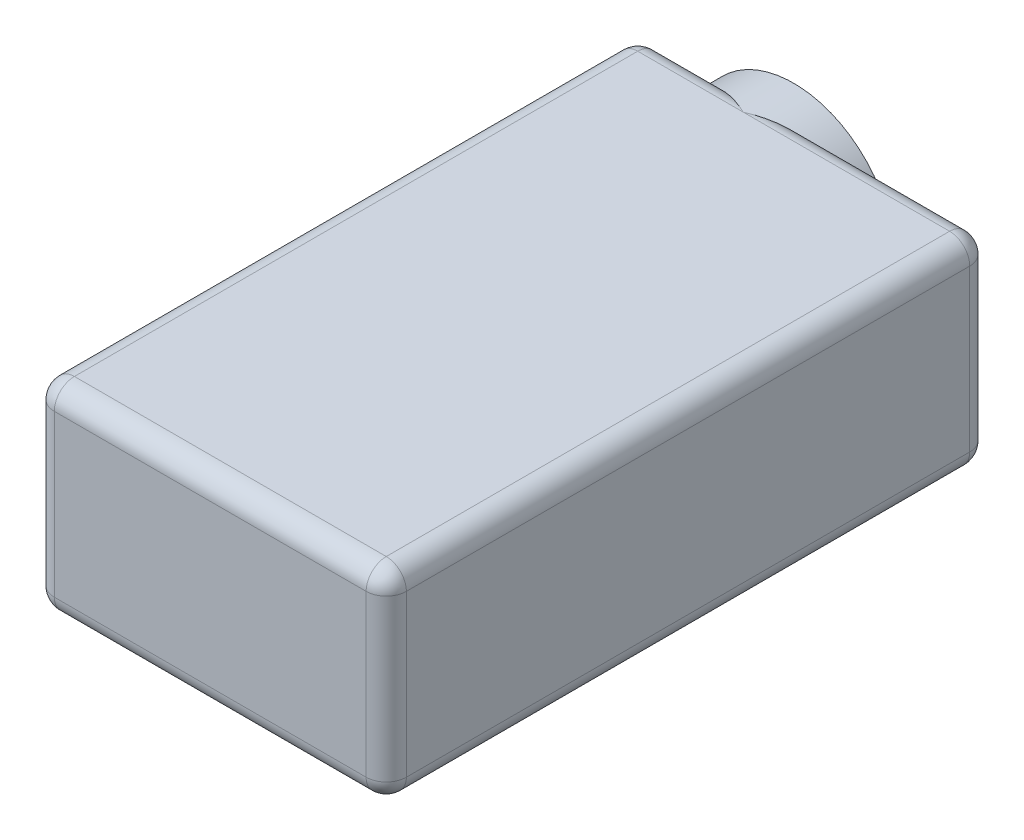
ISO-10303-21;
HEADER;
FILE_DESCRIPTION(('STEP AP214'),'2;1');
FILE_NAME('part.step','',(''),(''),'','','');
FILE_SCHEMA(('AUTOMOTIVE_DESIGN { 1 0 10303 214 1 1 1 1 }'));
ENDSEC;
DATA;
#1=APPLICATION_CONTEXT('core data for automotive mechanical design processes');
#2=APPLICATION_PROTOCOL_DEFINITION('international standard','automotive_design',2000,#1);
#3=PRODUCT_CONTEXT('',#1,'mechanical');
#4=PRODUCT('Part','Part','',(#3));
#5=PRODUCT_RELATED_PRODUCT_CATEGORY('part','',(#4));
#6=PRODUCT_DEFINITION_FORMATION('','',#4);
#7=PRODUCT_DEFINITION_CONTEXT('part definition',#1,'design');
#8=PRODUCT_DEFINITION('design','',#6,#7);
#9=PRODUCT_DEFINITION_SHAPE('','',#8);
#10=(LENGTH_UNIT() NAMED_UNIT(*) SI_UNIT(.MILLI.,.METRE.));
#11=(NAMED_UNIT(*) PLANE_ANGLE_UNIT() SI_UNIT($,.RADIAN.));
#12=(NAMED_UNIT(*) SI_UNIT($,.STERADIAN.) SOLID_ANGLE_UNIT());
#13=UNCERTAINTY_MEASURE_WITH_UNIT(LENGTH_MEASURE(1.E-05),#10,'distance_accuracy_value','');
#14=(GEOMETRIC_REPRESENTATION_CONTEXT(3) GLOBAL_UNCERTAINTY_ASSIGNED_CONTEXT((#13)) GLOBAL_UNIT_ASSIGNED_CONTEXT((#10,
#11,#12)) REPRESENTATION_CONTEXT('',''));
#15=CARTESIAN_POINT('',(0.,0.,0.));
#16=DIRECTION('',(0.,0.,1.));
#17=DIRECTION('',(1.,0.,0.));
#18=AXIS2_PLACEMENT_3D('',#15,#16,#17);
#19=CARTESIAN_POINT('',(-17.5,20.,-30.));
#20=DIRECTION('',(0.,0.,1.));
#21=DIRECTION('',(1.,0.,0.));
#22=AXIS2_PLACEMENT_3D('',#19,#20,#21);
#23=PLANE('',#22);
#24=DIRECTION('',(-1.,0.,0.));
#25=VECTOR('',#24,1.);
#26=CARTESIAN_POINT('',(-17.5,18.,-30.));
#27=LINE('',#26,#25);
#28=CARTESIAN_POINT('',(-15.5,18.,-30.));
#29=VERTEX_POINT('',#28);
#30=CARTESIAN_POINT('',(-11.,18.,-30.));
#31=VERTEX_POINT('',#30);
#32=EDGE_CURVE('E162',#29,#31,#27,.F.);
#33=ORIENTED_EDGE('',*,*,#32,.T.);
#34=CARTESIAN_POINT('',(-5.,10.,-30.));
#35=DIRECTION('',(0.,0.,1.));
#36=DIRECTION('',(1.,0.,0.));
#37=AXIS2_PLACEMENT_3D('',#34,#35,#36);
#38=CIRCLE('',#37,10.);
#39=CARTESIAN_POINT('',(-11.,2.,-30.));
#40=VERTEX_POINT('',#39);
#41=EDGE_CURVE('E161',#31,#40,#38,.T.);
#42=ORIENTED_EDGE('',*,*,#41,.T.);
#43=DIRECTION('',(-1.,0.,0.));
#44=VECTOR('',#43,1.);
#45=CARTESIAN_POINT('',(-17.5,2.,-30.));
#46=LINE('',#45,#44);
#47=CARTESIAN_POINT('',(-15.5,2.,-30.));
#48=VERTEX_POINT('',#47);
#49=EDGE_CURVE('E147',#40,#48,#46,.T.);
#50=ORIENTED_EDGE('',*,*,#49,.T.);
#51=DIRECTION('',(0.,-1.,0.));
#52=VECTOR('',#51,1.);
#53=CARTESIAN_POINT('',(-15.5,20.,-30.));
#54=LINE('',#53,#52);
#55=EDGE_CURVE('E158',#48,#29,#54,.F.);
#56=ORIENTED_EDGE('',*,*,#55,.T.);
#57=EDGE_LOOP('',(#33,#42,#50,#56));
#58=FACE_BOUND('',#57,.T.);
#59=ADVANCED_FACE('F33',(#58),#23,.F.);
#60=CARTESIAN_POINT('',(0.,18.,-28.));
#61=DIRECTION('',(-1.,0.,0.));
#62=DIRECTION('',(0.,0.,1.));
#63=AXIS2_PLACEMENT_3D('',#60,#61,#62);
#64=CYLINDRICAL_SURFACE('',#63,2.);
#65=CARTESIAN_POINT('',(-11.,18.,-30.));
#66=CARTESIAN_POINT('',(-10.9369536224631,18.0472862882957,-29.9999954704325));
#67=CARTESIAN_POINT('',(-10.8733624225271,18.0938134787529,-29.9983236145491));
#68=CARTESIAN_POINT('',(-10.7452199474967,18.1852695333375,-29.9919285918336));
#69=CARTESIAN_POINT('',(-10.6806689822841,18.2301988981222,-29.9872063898342));
#70=CARTESIAN_POINT('',(-10.4859703158345,18.3623378279778,-29.9689117195481));
#71=CARTESIAN_POINT('',(-10.3545238112513,18.4470878572111,-29.9512088855844));
#72=CARTESIAN_POINT('',(-10.0898913085944,18.6091190391924,-29.9068252398303));
#73=CARTESIAN_POINT('',(-9.9567231295198,18.6864469043144,-29.8802060675995));
#74=CARTESIAN_POINT('',(-9.68822829248466,18.8342526275324,-29.8194524225561));
#75=CARTESIAN_POINT('',(-9.55290027046692,18.904725939813,-29.7853130107879));
#76=CARTESIAN_POINT('',(-9.19386066920139,19.081477109722,-29.6870630509099));
#77=CARTESIAN_POINT('',(-8.96872744405728,19.1819879312217,-29.6177082570013));
#78=CARTESIAN_POINT('',(-8.51531575035662,19.3649551460672,-29.466620027569));
#79=CARTESIAN_POINT('',(-8.28703598898859,19.4474038680968,-29.3848813572129));
#80=CARTESIAN_POINT('',(-7.82739571511391,19.5950152471495,-29.2119794583593));
#81=CARTESIAN_POINT('',(-7.59602666438796,19.6601092975224,-29.1207807482314));
#82=CARTESIAN_POINT('',(-7.13185849777535,19.7730351186086,-28.9319051562162));
#83=CARTESIAN_POINT('',(-6.8990598651593,19.8208724279425,-28.8342303647894));
#84=CARTESIAN_POINT('',(-6.39179187240824,19.9065704488633,-28.6171555408011));
#85=CARTESIAN_POINT('',(-6.11713414409591,19.9412373642432,-28.4969369257089));
#86=CARTESIAN_POINT('',(-5.56770287236358,19.9876693958688,-28.2538571616655));
#87=CARTESIAN_POINT('',(-5.29293075740746,19.9994819850186,-28.1310020275233));
#88=CARTESIAN_POINT('',(-5.01217156566726,19.99999444154,-28.0054432888421));
#89=CARTESIAN_POINT('',(-5.00608575618738,19.9999999968566,-28.0027216320485));
#90=CARTESIAN_POINT('',(-5.,20.,-28.));
#91=B_SPLINE_CURVE_WITH_KNOTS('',3,(#65,#66,#67,#68,#69,#70,#71,#72,#73,#74,#75,#76,#77,#78,#79,
#80,#81,#82,#83,#84,#85,#86,#87,#88,#89,#90),.UNSPECIFIED.,.F.,.F.,(4,2,2,2,2,2,2,2,2,2,2,2,4),
(0.,0.236371159892259,0.472667591526935,0.944315101860225,1.41276713949742,1.88152775757088,
2.64870335126686,3.41620414998971,4.18669550285127,4.9569393429184,5.86148159841712,
6.76414291697836,6.78414292392342),.UNSPECIFIED.);
#92=CARTESIAN_POINT('',(-5.,20.,-28.));
#93=VERTEX_POINT('',#92);
#94=EDGE_CURVE('E61',#31,#93,#91,.T.);
#95=ORIENTED_EDGE('',*,*,#94,.F.);
#96=ORIENTED_EDGE('',*,*,#32,.F.);
#97=CARTESIAN_POINT('',(-15.5,18.,-28.));
#98=DIRECTION('',(-1.,0.,0.));
#99=DIRECTION('',(0.,0.,1.));
#100=AXIS2_PLACEMENT_3D('',#97,#98,#99);
#101=CIRCLE('',#100,2.);
#102=CARTESIAN_POINT('',(-15.5,20.,-28.));
#103=VERTEX_POINT('',#102);
#104=EDGE_CURVE('E342',#103,#29,#101,.T.);
#105=ORIENTED_EDGE('',*,*,#104,.F.);
#106=DIRECTION('',(-1.,0.,0.));
#107=VECTOR('',#106,1.);
#108=CARTESIAN_POINT('',(0.,20.,-28.));
#109=LINE('',#108,#107);
#110=EDGE_CURVE('E303',#93,#103,#109,.T.);
#111=ORIENTED_EDGE('',*,*,#110,.F.);
#112=EDGE_LOOP('',(#95,#96,#105,#111));
#113=FACE_BOUND('',#112,.T.);
#114=ADVANCED_FACE('F247',(#113),#64,.T.);
#115=CARTESIAN_POINT('',(-17.5,2.,-28.));
#116=DIRECTION('',(1.,0.,0.));
#117=DIRECTION('',(0.,0.,-1.));
#118=AXIS2_PLACEMENT_3D('',#115,#116,#117);
#119=CYLINDRICAL_SURFACE('',#118,2.);
#120=CARTESIAN_POINT('',(1.00000000000001,2.,-30.));
#121=CARTESIAN_POINT('',(0.936953622463164,1.95271371170432,-29.9999954704325));
#122=CARTESIAN_POINT('',(0.873362422527192,1.90618652124718,-29.9983236145491));
#123=CARTESIAN_POINT('',(0.745219947496929,1.8147304666626,-29.9919285918336));
#124=CARTESIAN_POINT('',(0.680668982284341,1.76980110187795,-29.9872063898342));
#125=CARTESIAN_POINT('',(0.485970315834909,1.63766217202242,-29.9689117195482));
#126=CARTESIAN_POINT('',(0.354523811251751,1.55291214278924,-29.9512088855845));
#127=CARTESIAN_POINT('',(0.0898913085948727,1.39088096080787,-29.9068252398304));
#128=CARTESIAN_POINT('',(-0.0432768704797975,1.31355309568585,-29.8802060675996));
#129=CARTESIAN_POINT('',(-0.311771707515132,1.16574737246771,-29.8194524225562));
#130=CARTESIAN_POINT('',(-0.44709972953297,1.09527406018707,-29.7853130107879));
#131=CARTESIAN_POINT('',(-0.806139330798666,0.91852289027801,-29.6870630509099));
#132=CARTESIAN_POINT('',(-1.03127255594286,0.818012068778287,-29.6177082570013));
#133=CARTESIAN_POINT('',(-1.48468424964363,0.635044853932708,-29.4666200275689));
#134=CARTESIAN_POINT('',(-1.7129640110117,0.552596131903133,-29.3848813572127));
#135=CARTESIAN_POINT('',(-2.17260428488641,0.404984752850376,-29.2119794583592));
#136=CARTESIAN_POINT('',(-2.40397333561234,0.339890702477487,-29.1207807482315));
#137=CARTESIAN_POINT('',(-2.86814150222466,0.226964881391389,-28.931905156216));
#138=CARTESIAN_POINT('',(-3.10094013484045,0.179127572057451,-28.8342303647887));
#139=CARTESIAN_POINT('',(-3.60820812759206,0.0934295511366845,-28.6171555408019));
#140=CARTESIAN_POINT('',(-3.88286585590538,0.0587626357568432,-28.4969369257119));
#141=CARTESIAN_POINT('',(-4.43229712763504,0.0123306041312244,-28.2538571616625));
#142=CARTESIAN_POINT('',(-4.70706924258752,0.000518014981410508,-28.1310020275121));
#143=CARTESIAN_POINT('',(-4.98782843433252,5.55846002551166E-06,-28.0054432888416));
#144=CARTESIAN_POINT('',(-4.9939142438125,3.14339607136225E-09,-28.0027216320482));
#145=CARTESIAN_POINT('',(-5.,0.,-28.));
#146=B_SPLINE_CURVE_WITH_KNOTS('',3,(#120,#121,#122,#123,#124,#125,#126,#127,#128,#129,#130,
#131,#132,#133,#134,#135,#136,#137,#138,#139,#140,#141,#142,#143,#144,#145),.UNSPECIFIED.,.F.,
.F.,(4,2,2,2,2,2,2,2,2,2,2,2,4),(0.,0.236371159892096,0.472667591526608,0.944315101859549,
1.41276713949708,1.88152775757088,2.6487033512671,3.41620414999013,4.18669550285145,
4.95693934291839,5.86148159841708,6.76414291697836,6.78414292392342),.UNSPECIFIED.);
#147=CARTESIAN_POINT('',(1.00000000000001,2.,-30.));
#148=VERTEX_POINT('',#147);
#149=CARTESIAN_POINT('',(-5.,0.,-28.));
#150=VERTEX_POINT('',#149);
#151=EDGE_CURVE('E11',#148,#150,#146,.T.);
#152=ORIENTED_EDGE('',*,*,#151,.F.);
#153=CARTESIAN_POINT('',(15.5,2.,-30.));
#154=VERTEX_POINT('',#153);
#155=EDGE_CURVE('E157',#154,#148,#46,.T.);
#156=ORIENTED_EDGE('',*,*,#155,.F.);
#157=CARTESIAN_POINT('',(15.5,2.,-28.));
#158=DIRECTION('',(1.,0.,0.));
#159=DIRECTION('',(0.,0.,-1.));
#160=AXIS2_PLACEMENT_3D('',#157,#158,#159);
#161=CIRCLE('',#160,2.);
#162=CARTESIAN_POINT('',(15.5,0.,-28.));
#163=VERTEX_POINT('',#162);
#164=EDGE_CURVE('E309',#154,#163,#161,.F.);
#165=ORIENTED_EDGE('',*,*,#164,.T.);
#166=DIRECTION('',(-1.,0.,0.));
#167=VECTOR('',#166,1.);
#168=CARTESIAN_POINT('',(17.5,0.,-28.));
#169=LINE('',#168,#167);
#170=EDGE_CURVE('E270',#150,#163,#169,.F.);
#171=ORIENTED_EDGE('',*,*,#170,.F.);
#172=EDGE_LOOP('',(#152,#156,#165,#171));
#173=FACE_BOUND('',#172,.T.);
#174=ADVANCED_FACE('F186',(#173),#119,.T.);
#175=CARTESIAN_POINT('',(17.5,20.,30.));
#176=DIRECTION('',(-1.,0.,0.));
#177=DIRECTION('',(0.,0.,1.));
#178=AXIS2_PLACEMENT_3D('',#175,#176,#177);
#179=PLANE('',#178);
#180=DIRECTION('',(0.,-1.,0.));
#181=VECTOR('',#180,1.);
#182=CARTESIAN_POINT('',(17.5,20.,28.));
#183=LINE('',#182,#181);
#184=CARTESIAN_POINT('',(17.5,18.,28.));
#185=VERTEX_POINT('',#184);
#186=CARTESIAN_POINT('',(17.5,2.,28.));
#187=VERTEX_POINT('',#186);
#188=EDGE_CURVE('E296',#185,#187,#183,.T.);
#189=ORIENTED_EDGE('',*,*,#188,.T.);
#190=DIRECTION('',(0.,0.,-1.));
#191=VECTOR('',#190,1.);
#192=CARTESIAN_POINT('',(17.5,2.,-30.));
#193=LINE('',#192,#191);
#194=CARTESIAN_POINT('',(17.5,2.,-28.));
#195=VERTEX_POINT('',#194);
#196=EDGE_CURVE('E299',#187,#195,#193,.T.);
#197=ORIENTED_EDGE('',*,*,#196,.T.);
#198=DIRECTION('',(0.,-1.,0.));
#199=VECTOR('',#198,1.);
#200=CARTESIAN_POINT('',(17.5,20.,-28.));
#201=LINE('',#200,#199);
#202=CARTESIAN_POINT('',(17.5,18.,-28.));
#203=VERTEX_POINT('',#202);
#204=EDGE_CURVE('E294',#195,#203,#201,.F.);
#205=ORIENTED_EDGE('',*,*,#204,.T.);
#206=DIRECTION('',(0.,0.,-1.));
#207=VECTOR('',#206,1.);
#208=CARTESIAN_POINT('',(17.5,18.,30.));
#209=LINE('',#208,#207);
#210=EDGE_CURVE('E292',#203,#185,#209,.F.);
#211=ORIENTED_EDGE('',*,*,#210,.T.);
#212=EDGE_LOOP('',(#189,#197,#205,#211));
#213=FACE_BOUND('',#212,.T.);
#214=ADVANCED_FACE('F187',(#213),#179,.F.);
#215=ORIENTED_EDGE('',*,*,#155,.T.);
#216=CARTESIAN_POINT('',(1.,18.,-30.));
#217=VERTEX_POINT('',#216);
#218=EDGE_CURVE('E53',#148,#217,#38,.T.);
#219=ORIENTED_EDGE('',*,*,#218,.T.);
#220=CARTESIAN_POINT('',(15.5,18.,-30.));
#221=VERTEX_POINT('',#220);
#222=EDGE_CURVE('E261',#217,#221,#27,.F.);
#223=ORIENTED_EDGE('',*,*,#222,.T.);
#224=DIRECTION('',(0.,-1.,0.));
#225=VECTOR('',#224,1.);
#226=CARTESIAN_POINT('',(15.5,20.,-30.));
#227=LINE('',#226,#225);
#228=EDGE_CURVE('E260',#221,#154,#227,.T.);
#229=ORIENTED_EDGE('',*,*,#228,.T.);
#230=EDGE_LOOP('',(#215,#219,#223,#229));
#231=FACE_BOUND('',#230,.T.);
#232=ADVANCED_FACE('F380',(#231),#23,.F.);
#233=CARTESIAN_POINT('',(-17.5,20.,30.));
#234=DIRECTION('',(1.,0.,0.));
#235=DIRECTION('',(0.,0.,-1.));
#236=AXIS2_PLACEMENT_3D('',#233,#234,#235);
#237=PLANE('',#236);
#238=DIRECTION('',(0.,0.,1.));
#239=VECTOR('',#238,1.);
#240=CARTESIAN_POINT('',(-17.5,18.,30.));
#241=LINE('',#240,#239);
#242=CARTESIAN_POINT('',(-17.5,18.,28.));
#243=VERTEX_POINT('',#242);
#244=CARTESIAN_POINT('',(-17.5,18.,-28.));
#245=VERTEX_POINT('',#244);
#246=EDGE_CURVE('E274',#243,#245,#241,.F.);
#247=ORIENTED_EDGE('',*,*,#246,.T.);
#248=DIRECTION('',(0.,-1.,0.));
#249=VECTOR('',#248,1.);
#250=CARTESIAN_POINT('',(-17.5,20.,-28.));
#251=LINE('',#250,#249);
#252=CARTESIAN_POINT('',(-17.5,2.,-28.));
#253=VERTEX_POINT('',#252);
#254=EDGE_CURVE('E280',#245,#253,#251,.T.);
#255=ORIENTED_EDGE('',*,*,#254,.T.);
#256=DIRECTION('',(0.,0.,1.));
#257=VECTOR('',#256,1.);
#258=CARTESIAN_POINT('',(-17.5,2.,30.));
#259=LINE('',#258,#257);
#260=CARTESIAN_POINT('',(-17.5,2.,28.));
#261=VERTEX_POINT('',#260);
#262=EDGE_CURVE('E278',#253,#261,#259,.T.);
#263=ORIENTED_EDGE('',*,*,#262,.T.);
#264=DIRECTION('',(0.,-1.,0.));
#265=VECTOR('',#264,1.);
#266=CARTESIAN_POINT('',(-17.5,20.,28.));
#267=LINE('',#266,#265);
#268=EDGE_CURVE('E276',#261,#243,#267,.F.);
#269=ORIENTED_EDGE('',*,*,#268,.T.);
#270=EDGE_LOOP('',(#247,#255,#263,#269));
#271=FACE_BOUND('',#270,.T.);
#272=ADVANCED_FACE('F425',(#271),#237,.F.);
#273=CARTESIAN_POINT('',(-17.5,20.,30.));
#274=DIRECTION('',(0.,0.,-1.));
#275=DIRECTION('',(-1.,0.,0.));
#276=AXIS2_PLACEMENT_3D('',#273,#274,#275);
#277=PLANE('',#276);
#278=DIRECTION('',(1.,0.,0.));
#279=VECTOR('',#278,1.);
#280=CARTESIAN_POINT('',(-17.5,18.,30.));
#281=LINE('',#280,#279);
#282=CARTESIAN_POINT('',(15.5,18.,30.));
#283=VERTEX_POINT('',#282);
#284=CARTESIAN_POINT('',(-15.5,18.,30.));
#285=VERTEX_POINT('',#284);
#286=EDGE_CURVE('E283',#283,#285,#281,.F.);
#287=ORIENTED_EDGE('',*,*,#286,.T.);
#288=DIRECTION('',(0.,-1.,0.));
#289=VECTOR('',#288,1.);
#290=CARTESIAN_POINT('',(-15.5,20.,30.));
#291=LINE('',#290,#289);
#292=CARTESIAN_POINT('',(-15.5,2.,30.));
#293=VERTEX_POINT('',#292);
#294=EDGE_CURVE('E289',#285,#293,#291,.T.);
#295=ORIENTED_EDGE('',*,*,#294,.T.);
#296=DIRECTION('',(1.,0.,0.));
#297=VECTOR('',#296,1.);
#298=CARTESIAN_POINT('',(17.5,2.,30.));
#299=LINE('',#298,#297);
#300=CARTESIAN_POINT('',(15.5,2.,30.));
#301=VERTEX_POINT('',#300);
#302=EDGE_CURVE('E287',#293,#301,#299,.T.);
#303=ORIENTED_EDGE('',*,*,#302,.T.);
#304=DIRECTION('',(0.,-1.,0.));
#305=VECTOR('',#304,1.);
#306=CARTESIAN_POINT('',(15.5,20.,30.));
#307=LINE('',#306,#305);
#308=EDGE_CURVE('E285',#301,#283,#307,.F.);
#309=ORIENTED_EDGE('',*,*,#308,.T.);
#310=EDGE_LOOP('',(#287,#295,#303,#309));
#311=FACE_BOUND('',#310,.T.);
#312=ADVANCED_FACE('F430',(#311),#277,.F.);
#313=CARTESIAN_POINT('',(0.,20.,0.));
#314=DIRECTION('',(0.,-1.,0.));
#315=DIRECTION('',(0.,0.,-1.));
#316=AXIS2_PLACEMENT_3D('',#313,#314,#315);
#317=PLANE('',#316);
#318=CARTESIAN_POINT('',(15.5,20.,-28.));
#319=VERTEX_POINT('',#318);
#320=EDGE_CURVE('E304',#319,#93,#109,.T.);
#321=ORIENTED_EDGE('',*,*,#320,.T.);
#322=ORIENTED_EDGE('',*,*,#110,.T.);
#323=DIRECTION('',(0.,0.,1.));
#324=VECTOR('',#323,1.);
#325=CARTESIAN_POINT('',(-15.5,20.,0.));
#326=LINE('',#325,#324);
#327=CARTESIAN_POINT('',(-15.5,20.,28.));
#328=VERTEX_POINT('',#327);
#329=EDGE_CURVE('E170',#103,#328,#326,.T.);
#330=ORIENTED_EDGE('',*,*,#329,.T.);
#331=DIRECTION('',(1.,0.,0.));
#332=VECTOR('',#331,1.);
#333=CARTESIAN_POINT('',(0.,20.,28.));
#334=LINE('',#333,#332);
#335=CARTESIAN_POINT('',(15.5,20.,28.));
#336=VERTEX_POINT('',#335);
#337=EDGE_CURVE('E168',#328,#336,#334,.T.);
#338=ORIENTED_EDGE('',*,*,#337,.T.);
#339=DIRECTION('',(0.,0.,-1.));
#340=VECTOR('',#339,1.);
#341=CARTESIAN_POINT('',(15.5,20.,0.));
#342=LINE('',#341,#340);
#343=EDGE_CURVE('E301',#336,#319,#342,.T.);
#344=ORIENTED_EDGE('',*,*,#343,.T.);
#345=EDGE_LOOP('',(#321,#322,#330,#338,#344));
#346=FACE_BOUND('',#345,.T.);
#347=ADVANCED_FACE('F464',(#346),#317,.F.);
#348=CARTESIAN_POINT('',(0.,0.,0.));
#349=DIRECTION('',(0.,-1.,0.));
#350=DIRECTION('',(0.,0.,-1.));
#351=AXIS2_PLACEMENT_3D('',#348,#349,#350);
#352=PLANE('',#351);
#353=CARTESIAN_POINT('',(-15.5,0.,-28.));
#354=VERTEX_POINT('',#353);
#355=EDGE_CURVE('E271',#354,#150,#169,.F.);
#356=ORIENTED_EDGE('',*,*,#355,.T.);
#357=ORIENTED_EDGE('',*,*,#170,.T.);
#358=DIRECTION('',(0.,0.,-1.));
#359=VECTOR('',#358,1.);
#360=CARTESIAN_POINT('',(15.5,0.,30.));
#361=LINE('',#360,#359);
#362=CARTESIAN_POINT('',(15.5,0.,28.));
#363=VERTEX_POINT('',#362);
#364=EDGE_CURVE('E264',#163,#363,#361,.F.);
#365=ORIENTED_EDGE('',*,*,#364,.T.);
#366=DIRECTION('',(1.,0.,0.));
#367=VECTOR('',#366,1.);
#368=CARTESIAN_POINT('',(-17.5,0.,28.));
#369=LINE('',#368,#367);
#370=CARTESIAN_POINT('',(-15.5,0.,28.));
#371=VERTEX_POINT('',#370);
#372=EDGE_CURVE('E266',#363,#371,#369,.F.);
#373=ORIENTED_EDGE('',*,*,#372,.T.);
#374=DIRECTION('',(0.,0.,1.));
#375=VECTOR('',#374,1.);
#376=CARTESIAN_POINT('',(-15.5,0.,-30.));
#377=LINE('',#376,#375);
#378=EDGE_CURVE('E268',#371,#354,#377,.F.);
#379=ORIENTED_EDGE('',*,*,#378,.T.);
#380=EDGE_LOOP('',(#356,#357,#365,#373,#379));
#381=FACE_BOUND('',#380,.T.);
#382=ADVANCED_FACE('F446',(#381),#352,.T.);
#383=CARTESIAN_POINT('',(0.,18.,28.));
#384=DIRECTION('',(1.,0.,0.));
#385=DIRECTION('',(0.,0.,-1.));
#386=AXIS2_PLACEMENT_3D('',#383,#384,#385);
#387=CYLINDRICAL_SURFACE('',#386,2.);
#388=CARTESIAN_POINT('',(15.5,18.,28.));
#389=DIRECTION('',(1.,0.,0.));
#390=DIRECTION('',(0.,0.,-1.));
#391=AXIS2_PLACEMENT_3D('',#388,#389,#390);
#392=CIRCLE('',#391,2.);
#393=EDGE_CURVE('E176',#336,#283,#392,.T.);
#394=ORIENTED_EDGE('',*,*,#393,.F.);
#395=ORIENTED_EDGE('',*,*,#337,.F.);
#396=CARTESIAN_POINT('',(-15.5,18.,28.));
#397=DIRECTION('',(-1.,0.,0.));
#398=DIRECTION('',(0.,0.,1.));
#399=AXIS2_PLACEMENT_3D('',#396,#397,#398);
#400=CIRCLE('',#399,2.);
#401=EDGE_CURVE('E368',#285,#328,#400,.T.);
#402=ORIENTED_EDGE('',*,*,#401,.F.);
#403=ORIENTED_EDGE('',*,*,#286,.F.);
#404=EDGE_LOOP('',(#394,#395,#402,#403));
#405=FACE_BOUND('',#404,.T.);
#406=ADVANCED_FACE('F35',(#405),#387,.T.);
#407=CARTESIAN_POINT('',(15.5,18.,28.));
#408=DIRECTION('',(0.,0.,1.));
#409=DIRECTION('',(1.,0.,0.));
#410=AXIS2_PLACEMENT_3D('',#407,#408,#409);
#411=SPHERICAL_SURFACE('',#410,2.);
#412=CARTESIAN_POINT('',(15.5,18.,28.));
#413=DIRECTION('',(0.,0.,1.));
#414=DIRECTION('',(1.,0.,0.));
#415=AXIS2_PLACEMENT_3D('',#412,#413,#414);
#416=CIRCLE('',#415,2.);
#417=EDGE_CURVE('E363',#336,#185,#416,.F.);
#418=ORIENTED_EDGE('',*,*,#417,.F.);
#419=ORIENTED_EDGE('',*,*,#393,.T.);
#420=CARTESIAN_POINT('',(15.5,18.,28.));
#421=DIRECTION('',(0.,1.,0.));
#422=DIRECTION('',(0.,0.,1.));
#423=AXIS2_PLACEMENT_3D('',#420,#421,#422);
#424=CIRCLE('',#423,2.);
#425=EDGE_CURVE('E366',#185,#283,#424,.F.);
#426=ORIENTED_EDGE('',*,*,#425,.F.);
#427=EDGE_LOOP('',(#418,#419,#426));
#428=FACE_BOUND('',#427,.T.);
#429=ADVANCED_FACE('F472',(#428),#411,.T.);
#430=CARTESIAN_POINT('',(-15.5,18.,28.));
#431=DIRECTION('',(0.,0.,1.));
#432=DIRECTION('',(1.,0.,0.));
#433=AXIS2_PLACEMENT_3D('',#430,#431,#432);
#434=SPHERICAL_SURFACE('',#433,2.);
#435=CARTESIAN_POINT('',(-15.5,18.,28.));
#436=DIRECTION('',(0.,1.,0.));
#437=DIRECTION('',(0.,0.,1.));
#438=AXIS2_PLACEMENT_3D('',#435,#436,#437);
#439=CIRCLE('',#438,2.);
#440=EDGE_CURVE('E357',#285,#243,#439,.F.);
#441=ORIENTED_EDGE('',*,*,#440,.F.);
#442=ORIENTED_EDGE('',*,*,#401,.T.);
#443=CARTESIAN_POINT('',(-15.5,18.,28.));
#444=DIRECTION('',(0.,0.,1.));
#445=DIRECTION('',(1.,0.,0.));
#446=AXIS2_PLACEMENT_3D('',#443,#444,#445);
#447=CIRCLE('',#446,2.);
#448=EDGE_CURVE('E360',#243,#328,#447,.F.);
#449=ORIENTED_EDGE('',*,*,#448,.F.);
#450=EDGE_LOOP('',(#441,#442,#449));
#451=FACE_BOUND('',#450,.T.);
#452=ADVANCED_FACE('F470',(#451),#434,.T.);
#453=CARTESIAN_POINT('',(15.5,20.,28.));
#454=DIRECTION('',(0.,-1.,0.));
#455=DIRECTION('',(0.,0.,-1.));
#456=AXIS2_PLACEMENT_3D('',#453,#454,#455);
#457=CYLINDRICAL_SURFACE('',#456,2.);
#458=ORIENTED_EDGE('',*,*,#425,.T.);
#459=ORIENTED_EDGE('',*,*,#308,.F.);
#460=CARTESIAN_POINT('',(15.5,2.,28.));
#461=DIRECTION('',(0.,-1.,0.));
#462=DIRECTION('',(0.,0.,-1.));
#463=AXIS2_PLACEMENT_3D('',#460,#461,#462);
#464=CIRCLE('',#463,2.);
#465=EDGE_CURVE('E351',#187,#301,#464,.T.);
#466=ORIENTED_EDGE('',*,*,#465,.F.);
#467=ORIENTED_EDGE('',*,*,#188,.F.);
#468=EDGE_LOOP('',(#458,#459,#466,#467));
#469=FACE_BOUND('',#468,.T.);
#470=ADVANCED_FACE('F440',(#469),#457,.T.);
#471=CARTESIAN_POINT('',(15.5,18.,0.));
#472=DIRECTION('',(0.,0.,-1.));
#473=DIRECTION('',(-1.,0.,0.));
#474=AXIS2_PLACEMENT_3D('',#471,#472,#473);
#475=CYLINDRICAL_SURFACE('',#474,2.);
#476=ORIENTED_EDGE('',*,*,#417,.T.);
#477=ORIENTED_EDGE('',*,*,#210,.F.);
#478=CARTESIAN_POINT('',(15.5,18.,-28.));
#479=DIRECTION('',(0.,0.,-1.));
#480=DIRECTION('',(-1.,0.,0.));
#481=AXIS2_PLACEMENT_3D('',#478,#479,#480);
#482=CIRCLE('',#481,2.);
#483=EDGE_CURVE('E348',#319,#203,#482,.T.);
#484=ORIENTED_EDGE('',*,*,#483,.F.);
#485=ORIENTED_EDGE('',*,*,#343,.F.);
#486=EDGE_LOOP('',(#476,#477,#484,#485));
#487=FACE_BOUND('',#486,.T.);
#488=ADVANCED_FACE('F245',(#487),#475,.T.);
#489=CARTESIAN_POINT('',(1.00000000000001,18.,-30.));
#490=CARTESIAN_POINT('',(0.936953622463115,18.0472862882957,-29.9999954704325));
#491=CARTESIAN_POINT('',(0.8733624225271,18.0938134787529,-29.9983236145491));
#492=CARTESIAN_POINT('',(0.745219947496749,18.1852695333375,-29.9919285918336));
#493=CARTESIAN_POINT('',(0.680668982284117,18.2301988981222,-29.9872063898342));
#494=CARTESIAN_POINT('',(0.485970315834545,18.3623378279778,-29.9689117195481));
#495=CARTESIAN_POINT('',(0.35452381125129,18.447087857211,-29.9512088855844));
#496=CARTESIAN_POINT('',(0.0898913085944,18.6091190391924,-29.9068252398304));
#497=CARTESIAN_POINT('',(-0.0432768704801808,18.6864469043144,-29.8802060675995));
#498=CARTESIAN_POINT('',(-0.31177170751533,18.8342526275324,-29.8194524225561));
#499=CARTESIAN_POINT('',(-0.447099729533073,18.904725939813,-29.7853130107879));
#500=CARTESIAN_POINT('',(-0.806139330798603,19.081477109722,-29.6870630509099));
#501=CARTESIAN_POINT('',(-1.03127255594272,19.1819879312217,-29.6177082570013));
#502=CARTESIAN_POINT('',(-1.48468424964338,19.3649551460672,-29.466620027569));
#503=CARTESIAN_POINT('',(-1.71296401101141,19.4474038680968,-29.3848813572129));
#504=CARTESIAN_POINT('',(-2.17260428488609,19.5950152471495,-29.2119794583593));
#505=CARTESIAN_POINT('',(-2.40397333561204,19.6601092975224,-29.1207807482314));
#506=CARTESIAN_POINT('',(-2.86814150222464,19.7730351186086,-28.9319051562162));
#507=CARTESIAN_POINT('',(-3.10094013484068,19.8208724279425,-28.8342303647894));
#508=CARTESIAN_POINT('',(-3.60820812759177,19.9065704488633,-28.6171555408012));
#509=CARTESIAN_POINT('',(-3.88286585590412,19.9412373642432,-28.496936925709));
#510=CARTESIAN_POINT('',(-4.43229712763637,19.9876693958688,-28.2538571616654));
#511=CARTESIAN_POINT('',(-4.70706924259239,19.9994819850186,-28.131002027523));
#512=CARTESIAN_POINT('',(-4.98782843433274,19.99999444154,-28.0054432888421));
#513=CARTESIAN_POINT('',(-4.99391424381261,19.9999999968566,-28.0027216320485));
#514=CARTESIAN_POINT('',(-5.,20.,-28.));
#515=B_SPLINE_CURVE_WITH_KNOTS('',3,(#489,#490,#491,#492,#493,#494,#495,#496,#497,#498,#499,
#500,#501,#502,#503,#504,#505,#506,#507,#508,#509,#510,#511,#512,#513,#514),.UNSPECIFIED.,.F.,
.F.,(4,2,2,2,2,2,2,2,2,2,2,2,4),(0.,0.236371159892255,0.472667591526929,0.944315101860205,
1.41276713949741,1.88152775757088,2.64870335126687,3.41620414998971,4.18669550285127,
4.9569393429184,5.86148159841712,6.76414291697836,6.78414292392342),.UNSPECIFIED.);
#516=EDGE_CURVE('E164',#93,#217,#515,.F.);
#517=ORIENTED_EDGE('',*,*,#516,.F.);
#518=ORIENTED_EDGE('',*,*,#320,.F.);
#519=CARTESIAN_POINT('',(15.5,18.,-28.));
#520=DIRECTION('',(1.,0.,0.));
#521=DIRECTION('',(0.,1.,0.));
#522=AXIS2_PLACEMENT_3D('',#519,#520,#521);
#523=CIRCLE('',#522,2.);
#524=EDGE_CURVE('E345',#221,#319,#523,.T.);
#525=ORIENTED_EDGE('',*,*,#524,.F.);
#526=ORIENTED_EDGE('',*,*,#222,.F.);
#527=EDGE_LOOP('',(#517,#518,#525,#526));
#528=FACE_BOUND('',#527,.T.);
#529=ADVANCED_FACE('F240',(#528),#64,.T.);
#530=CARTESIAN_POINT('',(-15.5,18.,0.));
#531=DIRECTION('',(0.,0.,1.));
#532=DIRECTION('',(1.,0.,0.));
#533=AXIS2_PLACEMENT_3D('',#530,#531,#532);
#534=CYLINDRICAL_SURFACE('',#533,2.);
#535=ORIENTED_EDGE('',*,*,#448,.T.);
#536=ORIENTED_EDGE('',*,*,#329,.F.);
#537=CARTESIAN_POINT('',(-15.5,18.,-28.));
#538=DIRECTION('',(0.,0.,-1.));
#539=DIRECTION('',(-1.,0.,0.));
#540=AXIS2_PLACEMENT_3D('',#537,#538,#539);
#541=CIRCLE('',#540,2.);
#542=EDGE_CURVE('E339',#245,#103,#541,.T.);
#543=ORIENTED_EDGE('',*,*,#542,.F.);
#544=ORIENTED_EDGE('',*,*,#246,.F.);
#545=EDGE_LOOP('',(#535,#536,#543,#544));
#546=FACE_BOUND('',#545,.T.);
#547=ADVANCED_FACE('F236',(#546),#534,.T.);
#548=CARTESIAN_POINT('',(-15.5,20.,28.));
#549=DIRECTION('',(0.,-1.,0.));
#550=DIRECTION('',(0.,0.,-1.));
#551=AXIS2_PLACEMENT_3D('',#548,#549,#550);
#552=CYLINDRICAL_SURFACE('',#551,2.);
#553=ORIENTED_EDGE('',*,*,#440,.T.);
#554=ORIENTED_EDGE('',*,*,#268,.F.);
#555=CARTESIAN_POINT('',(-15.5,2.,28.));
#556=DIRECTION('',(0.,-1.,0.));
#557=DIRECTION('',(0.,0.,-1.));
#558=AXIS2_PLACEMENT_3D('',#555,#556,#557);
#559=CIRCLE('',#558,2.);
#560=EDGE_CURVE('E336',#293,#261,#559,.T.);
#561=ORIENTED_EDGE('',*,*,#560,.F.);
#562=ORIENTED_EDGE('',*,*,#294,.F.);
#563=EDGE_LOOP('',(#553,#554,#561,#562));
#564=FACE_BOUND('',#563,.T.);
#565=ADVANCED_FACE('F232',(#564),#552,.T.);
#566=CARTESIAN_POINT('',(-17.5,2.,28.));
#567=DIRECTION('',(-1.,0.,0.));
#568=DIRECTION('',(0.,0.,1.));
#569=AXIS2_PLACEMENT_3D('',#566,#567,#568);
#570=CYLINDRICAL_SURFACE('',#569,2.);
#571=CARTESIAN_POINT('',(15.5,2.,28.));
#572=DIRECTION('',(1.,0.,0.));
#573=DIRECTION('',(0.,0.,-1.));
#574=AXIS2_PLACEMENT_3D('',#571,#572,#573);
#575=CIRCLE('',#574,2.);
#576=EDGE_CURVE('E354',#301,#363,#575,.T.);
#577=ORIENTED_EDGE('',*,*,#576,.F.);
#578=ORIENTED_EDGE('',*,*,#302,.F.);
#579=CARTESIAN_POINT('',(-15.5,2.,28.));
#580=DIRECTION('',(-1.,0.,0.));
#581=DIRECTION('',(0.,0.,1.));
#582=AXIS2_PLACEMENT_3D('',#579,#580,#581);
#583=CIRCLE('',#582,2.);
#584=EDGE_CURVE('E334',#371,#293,#583,.T.);
#585=ORIENTED_EDGE('',*,*,#584,.F.);
#586=ORIENTED_EDGE('',*,*,#372,.F.);
#587=EDGE_LOOP('',(#577,#578,#585,#586));
#588=FACE_BOUND('',#587,.T.);
#589=ADVANCED_FACE('F228',(#588),#570,.T.);
#590=CARTESIAN_POINT('',(15.5,2.,28.));
#591=DIRECTION('',(0.,0.,1.));
#592=DIRECTION('',(1.,0.,0.));
#593=AXIS2_PLACEMENT_3D('',#590,#591,#592);
#594=SPHERICAL_SURFACE('',#593,2.);
#595=ORIENTED_EDGE('',*,*,#465,.T.);
#596=ORIENTED_EDGE('',*,*,#576,.T.);
#597=CARTESIAN_POINT('',(15.5,2.,28.));
#598=DIRECTION('',(0.,0.,1.));
#599=DIRECTION('',(1.,0.,0.));
#600=AXIS2_PLACEMENT_3D('',#597,#598,#599);
#601=CIRCLE('',#600,2.);
#602=EDGE_CURVE('E331',#187,#363,#601,.F.);
#603=ORIENTED_EDGE('',*,*,#602,.F.);
#604=EDGE_LOOP('',(#595,#596,#603));
#605=FACE_BOUND('',#604,.T.);
#606=ADVANCED_FACE('F224',(#605),#594,.T.);
#607=CARTESIAN_POINT('',(15.5,18.,-28.));
#608=DIRECTION('',(0.,0.,1.));
#609=DIRECTION('',(1.,0.,0.));
#610=AXIS2_PLACEMENT_3D('',#607,#608,#609);
#611=SPHERICAL_SURFACE('',#610,2.);
#612=ORIENTED_EDGE('',*,*,#524,.T.);
#613=ORIENTED_EDGE('',*,*,#483,.T.);
#614=CARTESIAN_POINT('',(15.5,18.,-28.));
#615=DIRECTION('',(0.,1.,0.));
#616=DIRECTION('',(0.,0.,1.));
#617=AXIS2_PLACEMENT_3D('',#614,#615,#616);
#618=CIRCLE('',#617,2.);
#619=EDGE_CURVE('E328',#221,#203,#618,.F.);
#620=ORIENTED_EDGE('',*,*,#619,.F.);
#621=EDGE_LOOP('',(#612,#613,#620));
#622=FACE_BOUND('',#621,.T.);
#623=ADVANCED_FACE('F220',(#622),#611,.T.);
#624=CARTESIAN_POINT('',(-15.5,18.,-28.));
#625=DIRECTION('',(0.,0.,1.));
#626=DIRECTION('',(1.,0.,0.));
#627=AXIS2_PLACEMENT_3D('',#624,#625,#626);
#628=SPHERICAL_SURFACE('',#627,2.);
#629=ORIENTED_EDGE('',*,*,#542,.T.);
#630=ORIENTED_EDGE('',*,*,#104,.T.);
#631=CARTESIAN_POINT('',(-15.5,18.,-28.));
#632=DIRECTION('',(0.,1.,0.));
#633=DIRECTION('',(0.,0.,1.));
#634=AXIS2_PLACEMENT_3D('',#631,#632,#633);
#635=CIRCLE('',#634,2.);
#636=EDGE_CURVE('E325',#245,#29,#635,.F.);
#637=ORIENTED_EDGE('',*,*,#636,.F.);
#638=EDGE_LOOP('',(#629,#630,#637));
#639=FACE_BOUND('',#638,.T.);
#640=ADVANCED_FACE('F216',(#639),#628,.T.);
#641=CARTESIAN_POINT('',(-15.5,2.,28.));
#642=DIRECTION('',(0.,0.,1.));
#643=DIRECTION('',(1.,0.,0.));
#644=AXIS2_PLACEMENT_3D('',#641,#642,#643);
#645=SPHERICAL_SURFACE('',#644,2.);
#646=ORIENTED_EDGE('',*,*,#584,.T.);
#647=ORIENTED_EDGE('',*,*,#560,.T.);
#648=CARTESIAN_POINT('',(-15.5,2.,28.));
#649=DIRECTION('',(0.,0.,1.));
#650=DIRECTION('',(1.,0.,0.));
#651=AXIS2_PLACEMENT_3D('',#648,#649,#650);
#652=CIRCLE('',#651,2.);
#653=EDGE_CURVE('E322',#371,#261,#652,.F.);
#654=ORIENTED_EDGE('',*,*,#653,.F.);
#655=EDGE_LOOP('',(#646,#647,#654));
#656=FACE_BOUND('',#655,.T.);
#657=ADVANCED_FACE('F212',(#656),#645,.T.);
#658=CARTESIAN_POINT('',(15.5,2.,30.));
#659=DIRECTION('',(0.,0.,1.));
#660=DIRECTION('',(1.,0.,0.));
#661=AXIS2_PLACEMENT_3D('',#658,#659,#660);
#662=CYLINDRICAL_SURFACE('',#661,2.);
#663=ORIENTED_EDGE('',*,*,#602,.T.);
#664=ORIENTED_EDGE('',*,*,#364,.F.);
#665=CARTESIAN_POINT('',(15.5,2.,-28.));
#666=DIRECTION('',(0.,0.,-1.));
#667=DIRECTION('',(-1.,0.,0.));
#668=AXIS2_PLACEMENT_3D('',#665,#666,#667);
#669=CIRCLE('',#668,2.);
#670=EDGE_CURVE('E319',#195,#163,#669,.T.);
#671=ORIENTED_EDGE('',*,*,#670,.F.);
#672=ORIENTED_EDGE('',*,*,#196,.F.);
#673=EDGE_LOOP('',(#663,#664,#671,#672));
#674=FACE_BOUND('',#673,.T.);
#675=ADVANCED_FACE('F208',(#674),#662,.T.);
#676=CARTESIAN_POINT('',(15.5,20.,-28.));
#677=DIRECTION('',(0.,-1.,0.));
#678=DIRECTION('',(0.,0.,-1.));
#679=AXIS2_PLACEMENT_3D('',#676,#677,#678);
#680=CYLINDRICAL_SURFACE('',#679,2.);
#681=ORIENTED_EDGE('',*,*,#619,.T.);
#682=ORIENTED_EDGE('',*,*,#204,.F.);
#683=CARTESIAN_POINT('',(15.5,2.,-28.));
#684=DIRECTION('',(0.,-1.,0.));
#685=DIRECTION('',(0.,0.,-1.));
#686=AXIS2_PLACEMENT_3D('',#683,#684,#685);
#687=CIRCLE('',#686,2.);
#688=EDGE_CURVE('E316',#154,#195,#687,.T.);
#689=ORIENTED_EDGE('',*,*,#688,.F.);
#690=ORIENTED_EDGE('',*,*,#228,.F.);
#691=EDGE_LOOP('',(#681,#682,#689,#690));
#692=FACE_BOUND('',#691,.T.);
#693=ADVANCED_FACE('F204',(#692),#680,.T.);
#694=CARTESIAN_POINT('',(-15.5,20.,-28.));
#695=DIRECTION('',(0.,-1.,0.));
#696=DIRECTION('',(0.,0.,-1.));
#697=AXIS2_PLACEMENT_3D('',#694,#695,#696);
#698=CYLINDRICAL_SURFACE('',#697,2.);
#699=ORIENTED_EDGE('',*,*,#636,.T.);
#700=ORIENTED_EDGE('',*,*,#55,.F.);
#701=CARTESIAN_POINT('',(-15.5,2.,-28.));
#702=DIRECTION('',(0.,-1.,0.));
#703=DIRECTION('',(0.,0.,-1.));
#704=AXIS2_PLACEMENT_3D('',#701,#702,#703);
#705=CIRCLE('',#704,2.);
#706=EDGE_CURVE('E314',#253,#48,#705,.T.);
#707=ORIENTED_EDGE('',*,*,#706,.F.);
#708=ORIENTED_EDGE('',*,*,#254,.F.);
#709=EDGE_LOOP('',(#699,#700,#707,#708));
#710=FACE_BOUND('',#709,.T.);
#711=ADVANCED_FACE('F200',(#710),#698,.T.);
#712=CARTESIAN_POINT('',(-15.5,2.,30.));
#713=DIRECTION('',(0.,0.,-1.));
#714=DIRECTION('',(-1.,0.,0.));
#715=AXIS2_PLACEMENT_3D('',#712,#713,#714);
#716=CYLINDRICAL_SURFACE('',#715,2.);
#717=ORIENTED_EDGE('',*,*,#653,.T.);
#718=ORIENTED_EDGE('',*,*,#262,.F.);
#719=CARTESIAN_POINT('',(-15.5,2.,-28.));
#720=DIRECTION('',(0.,0.,-1.));
#721=DIRECTION('',(-1.,0.,0.));
#722=AXIS2_PLACEMENT_3D('',#719,#720,#721);
#723=CIRCLE('',#722,2.);
#724=EDGE_CURVE('E312',#354,#253,#723,.T.);
#725=ORIENTED_EDGE('',*,*,#724,.F.);
#726=ORIENTED_EDGE('',*,*,#378,.F.);
#727=EDGE_LOOP('',(#717,#718,#725,#726));
#728=FACE_BOUND('',#727,.T.);
#729=ADVANCED_FACE('F196',(#728),#716,.T.);
#730=CARTESIAN_POINT('',(15.5,2.,-28.));
#731=DIRECTION('',(0.,0.,1.));
#732=DIRECTION('',(1.,0.,0.));
#733=AXIS2_PLACEMENT_3D('',#730,#731,#732);
#734=SPHERICAL_SURFACE('',#733,2.);
#735=ORIENTED_EDGE('',*,*,#688,.T.);
#736=ORIENTED_EDGE('',*,*,#670,.T.);
#737=ORIENTED_EDGE('',*,*,#164,.F.);
#738=EDGE_LOOP('',(#735,#736,#737));
#739=FACE_BOUND('',#738,.T.);
#740=ADVANCED_FACE('F192',(#739),#734,.T.);
#741=CARTESIAN_POINT('',(-15.5,2.,-28.));
#742=DIRECTION('',(0.,0.,1.));
#743=DIRECTION('',(1.,0.,0.));
#744=AXIS2_PLACEMENT_3D('',#741,#742,#743);
#745=SPHERICAL_SURFACE('',#744,2.);
#746=ORIENTED_EDGE('',*,*,#724,.T.);
#747=ORIENTED_EDGE('',*,*,#706,.T.);
#748=CARTESIAN_POINT('',(-15.5,2.,-28.));
#749=DIRECTION('',(-1.,0.,0.));
#750=DIRECTION('',(0.,0.,1.));
#751=AXIS2_PLACEMENT_3D('',#748,#749,#750);
#752=CIRCLE('',#751,2.);
#753=EDGE_CURVE('E154',#354,#48,#752,.F.);
#754=ORIENTED_EDGE('',*,*,#753,.F.);
#755=EDGE_LOOP('',(#746,#747,#754));
#756=FACE_BOUND('',#755,.T.);
#757=ADVANCED_FACE('F185',(#756),#745,.T.);
#758=CARTESIAN_POINT('',(-11.,2.,-30.));
#759=CARTESIAN_POINT('',(-10.9369536224632,1.95271371170433,-29.9999954704325));
#760=CARTESIAN_POINT('',(-10.8733624225272,1.90618652124719,-29.9983236145491));
#761=CARTESIAN_POINT('',(-10.745219947497,1.81473046666262,-29.9919285918336));
#762=CARTESIAN_POINT('',(-10.6806689822844,1.76980110187797,-29.9872063898342));
#763=CARTESIAN_POINT('',(-10.485970315835,1.63766217202246,-29.9689117195482));
#764=CARTESIAN_POINT('',(-10.3545238112518,1.55291214278929,-29.9512088855845));
#765=CARTESIAN_POINT('',(-10.089891308595,1.39088096080792,-29.9068252398305));
#766=CARTESIAN_POINT('',(-9.95672312952027,1.31355309568589,-29.8802060675996));
#767=CARTESIAN_POINT('',(-9.6882282924849,1.16574737246772,-29.8194524225562));
#768=CARTESIAN_POINT('',(-9.55290027046705,1.09527406018708,-29.785313010788));
#769=CARTESIAN_POINT('',(-9.19386066920132,0.918522890278006,-29.6870630509099));
#770=CARTESIAN_POINT('',(-8.96872744405712,0.818012068778278,-29.6177082570013));
#771=CARTESIAN_POINT('',(-8.51531575035633,0.635044853932692,-29.4666200275689));
#772=CARTESIAN_POINT('',(-8.28703598898825,0.552596131903115,-29.3848813572127));
#773=CARTESIAN_POINT('',(-7.82739571511354,0.404984752850363,-29.2119794583592));
#774=CARTESIAN_POINT('',(-7.59602666438761,0.339890702477478,-29.1207807482315));
#775=CARTESIAN_POINT('',(-7.13185849777533,0.226964881391386,-28.931905156216));
#776=CARTESIAN_POINT('',(-6.89905986515959,0.179127572057449,-28.8342303647886));
#777=CARTESIAN_POINT('',(-6.39179187240789,0.0934295511366851,-28.617155540802));
#778=CARTESIAN_POINT('',(-6.1171341440944,0.0587626357568454,-28.4969369257124));
#779=CARTESIAN_POINT('',(-5.56770287236518,0.0123306041312228,-28.253857161662));
#780=CARTESIAN_POINT('',(-5.29293075741331,0.000518014981403773,-28.1310020275102));
#781=CARTESIAN_POINT('',(-5.01217156566751,5.55846002521769E-06,-28.0054432888415));
#782=CARTESIAN_POINT('',(-5.00608575618751,3.14339592256398E-09,-28.0027216320482));
#783=CARTESIAN_POINT('',(-5.,0.,-28.));
#784=B_SPLINE_CURVE_WITH_KNOTS('',3,(#758,#759,#760,#761,#762,#763,#764,#765,#766,#767,#768,
#769,#770,#771,#772,#773,#774,#775,#776,#777,#778,#779,#780,#781,#782,#783),.UNSPECIFIED.,.F.,
.F.,(4,2,2,2,2,2,2,2,2,2,2,2,4),(0.,0.236371159892066,0.472667591526551,0.944315101859433,
1.41276713949701,1.88152775757087,2.64870335126713,3.41620414999019,4.18669550285147,
4.95693934291838,5.86148159841707,6.76414291697836,6.78414292392342),.UNSPECIFIED.);
#785=EDGE_CURVE('E46',#150,#40,#784,.F.);
#786=ORIENTED_EDGE('',*,*,#785,.F.);
#787=ORIENTED_EDGE('',*,*,#355,.F.);
#788=ORIENTED_EDGE('',*,*,#753,.T.);
#789=ORIENTED_EDGE('',*,*,#49,.F.);
#790=EDGE_LOOP('',(#786,#787,#788,#789));
#791=FACE_BOUND('',#790,.T.);
#792=ADVANCED_FACE('F149',(#791),#119,.T.);
#793=CARTESIAN_POINT('',(-5.,10.,-27.));
#794=DIRECTION('',(0.,0.,-1.));
#795=DIRECTION('',(-1.,0.,0.));
#796=AXIS2_PLACEMENT_3D('',#793,#794,#795);
#797=CYLINDRICAL_SURFACE('',#796,10.);
#798=ORIENTED_EDGE('',*,*,#41,.F.);
#799=ORIENTED_EDGE('',*,*,#94,.T.);
#800=ORIENTED_EDGE('',*,*,#516,.T.);
#801=ORIENTED_EDGE('',*,*,#218,.F.);
#802=ORIENTED_EDGE('',*,*,#151,.T.);
#803=ORIENTED_EDGE('',*,*,#785,.T.);
#804=EDGE_LOOP('',(#798,#799,#800,#801,#802,#803));
#805=FACE_BOUND('',#804,.T.);
#806=CARTESIAN_POINT('',(-5.,10.,-33.));
#807=DIRECTION('',(0.,0.,-1.));
#808=DIRECTION('',(-1.,0.,0.));
#809=AXIS2_PLACEMENT_3D('',#806,#807,#808);
#810=CIRCLE('',#809,10.);
#811=CARTESIAN_POINT('',(-15.,10.,-33.));
#812=VERTEX_POINT('',#811);
#813=EDGE_CURVE('E393',#812,#812,#810,.T.);
#814=ORIENTED_EDGE('',*,*,#813,.F.);
#815=EDGE_LOOP('',(#814));
#816=FACE_BOUND('',#815,.T.);
#817=ADVANCED_FACE('F166',(#805,#816),#797,.T.);
#818=CARTESIAN_POINT('',(-5.,10.,-33.));
#819=DIRECTION('',(0.,0.,-1.));
#820=DIRECTION('',(-1.,0.,0.));
#821=AXIS2_PLACEMENT_3D('',#818,#819,#820);
#822=PLANE('',#821);
#823=CARTESIAN_POINT('',(-5.,10.,-33.));
#824=DIRECTION('',(0.,0.,-1.));
#825=DIRECTION('',(-1.,0.,0.));
#826=AXIS2_PLACEMENT_3D('',#823,#824,#825);
#827=CIRCLE('',#826,6.);
#828=CARTESIAN_POINT('',(-11.,10.,-33.));
#829=VERTEX_POINT('',#828);
#830=EDGE_CURVE('E398',#829,#829,#827,.T.);
#831=ORIENTED_EDGE('',*,*,#830,.F.);
#832=EDGE_LOOP('',(#831));
#833=FACE_BOUND('',#832,.T.);
#834=ORIENTED_EDGE('',*,*,#813,.T.);
#835=EDGE_LOOP('',(#834));
#836=FACE_BOUND('',#835,.T.);
#837=ADVANCED_FACE('F409',(#833,#836),#822,.T.);
#838=CARTESIAN_POINT('',(-5.,10.,-32.));
#839=DIRECTION('',(0.,0.,-1.));
#840=DIRECTION('',(-1.,0.,0.));
#841=AXIS2_PLACEMENT_3D('',#838,#839,#840);
#842=CYLINDRICAL_SURFACE('',#841,6.);
#843=CARTESIAN_POINT('',(-5.,10.,-32.));
#844=DIRECTION('',(0.,0.,-1.));
#845=DIRECTION('',(-1.,0.,0.));
#846=AXIS2_PLACEMENT_3D('',#843,#844,#845);
#847=CIRCLE('',#846,6.);
#848=CARTESIAN_POINT('',(-11.,10.,-32.));
#849=VERTEX_POINT('',#848);
#850=EDGE_CURVE('E395',#849,#849,#847,.T.);
#851=ORIENTED_EDGE('',*,*,#850,.F.);
#852=EDGE_LOOP('',(#851));
#853=FACE_BOUND('',#852,.T.);
#854=ORIENTED_EDGE('',*,*,#830,.T.);
#855=EDGE_LOOP('',(#854));
#856=FACE_BOUND('',#855,.T.);
#857=ADVANCED_FACE('F406',(#853,#856),#842,.F.);
#858=CARTESIAN_POINT('',(-5.,10.,-32.));
#859=DIRECTION('',(0.,0.,-1.));
#860=DIRECTION('',(-1.,0.,0.));
#861=AXIS2_PLACEMENT_3D('',#858,#859,#860);
#862=PLANE('',#861);
#863=ORIENTED_EDGE('',*,*,#850,.T.);
#864=EDGE_LOOP('',(#863));
#865=FACE_BOUND('',#864,.T.);
#866=ADVANCED_FACE('F404',(#865),#862,.T.);
#867=CLOSED_SHELL('',(#59,#114,#174,#214,#232,#272,#312,#347,#382,#406,#429,#452,#470,#488,#529,
#547,#565,#589,#606,#623,#640,#657,#675,#693,#711,#729,#740,#757,#792,#817,#837,#857,#866));
#868=MANIFOLD_SOLID_BREP('B2',#867);
#869=ADVANCED_BREP_SHAPE_REPRESENTATION('',(#18,#868),#14);
#870=SHAPE_DEFINITION_REPRESENTATION(#9,#869);
ENDSEC;
END-ISO-10303-21;
